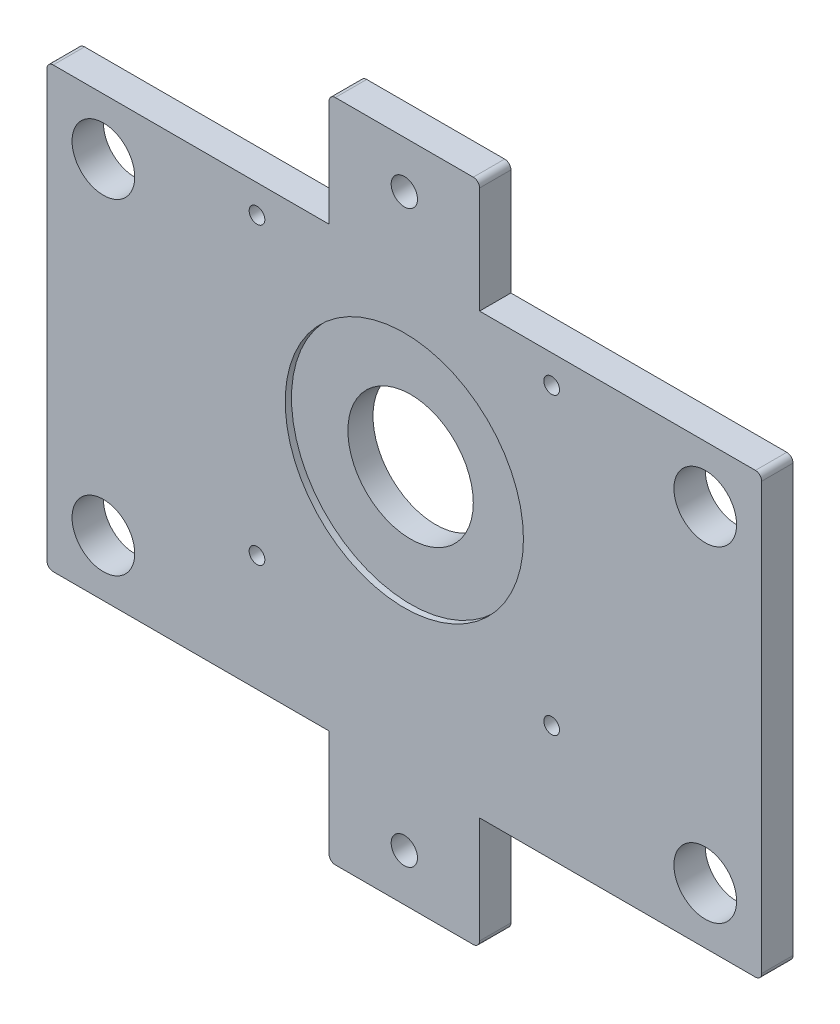
ISO-10303-21;
HEADER;
FILE_DESCRIPTION(('STEP AP214'),'2;1');
FILE_NAME('part.step','',(''),(''),'','','');
FILE_SCHEMA(('AUTOMOTIVE_DESIGN { 1 0 10303 214 1 1 1 1 }'));
ENDSEC;
DATA;
#1=APPLICATION_CONTEXT('core data for automotive mechanical design processes');
#2=APPLICATION_PROTOCOL_DEFINITION('international standard','automotive_design',2000,#1);
#3=PRODUCT_CONTEXT('',#1,'mechanical');
#4=PRODUCT('Part','Part','',(#3));
#5=PRODUCT_RELATED_PRODUCT_CATEGORY('part','',(#4));
#6=PRODUCT_DEFINITION_FORMATION('','',#4);
#7=PRODUCT_DEFINITION_CONTEXT('part definition',#1,'design');
#8=PRODUCT_DEFINITION('design','',#6,#7);
#9=PRODUCT_DEFINITION_SHAPE('','',#8);
#10=(LENGTH_UNIT() NAMED_UNIT(*) SI_UNIT(.MILLI.,.METRE.));
#11=(NAMED_UNIT(*) PLANE_ANGLE_UNIT() SI_UNIT($,.RADIAN.));
#12=(NAMED_UNIT(*) SI_UNIT($,.STERADIAN.) SOLID_ANGLE_UNIT());
#13=UNCERTAINTY_MEASURE_WITH_UNIT(LENGTH_MEASURE(1.E-05),#10,'distance_accuracy_value','');
#14=(GEOMETRIC_REPRESENTATION_CONTEXT(3) GLOBAL_UNCERTAINTY_ASSIGNED_CONTEXT((#13)) GLOBAL_UNIT_ASSIGNED_CONTEXT((#10,
#11,#12)) REPRESENTATION_CONTEXT('',''));
#15=CARTESIAN_POINT('',(0.,0.,0.));
#16=DIRECTION('',(0.,0.,1.));
#17=DIRECTION('',(1.,0.,0.));
#18=AXIS2_PLACEMENT_3D('',#15,#16,#17);
#19=CARTESIAN_POINT('',(0.,7.00000000000001,0.));
#20=DIRECTION('',(0.,0.,1.));
#21=DIRECTION('',(1.,0.,0.));
#22=AXIS2_PLACEMENT_3D('',#19,#20,#21);
#23=CYLINDRICAL_SURFACE('',#22,10.);
#24=CARTESIAN_POINT('',(0.,7.00000000000001,0.));
#25=DIRECTION('',(0.,0.,1.));
#26=DIRECTION('',(1.,0.,0.));
#27=AXIS2_PLACEMENT_3D('',#24,#25,#26);
#28=CIRCLE('',#27,10.);
#29=CARTESIAN_POINT('',(10.,7.00000000000001,0.));
#30=VERTEX_POINT('',#29);
#31=EDGE_CURVE('E446',#30,#30,#28,.T.);
#32=ORIENTED_EDGE('',*,*,#31,.F.);
#33=EDGE_LOOP('',(#32));
#34=FACE_BOUND('',#33,.T.);
#35=CARTESIAN_POINT('',(0.,7.00000000000001,4.));
#36=DIRECTION('',(0.,0.,1.));
#37=DIRECTION('',(1.,0.,0.));
#38=AXIS2_PLACEMENT_3D('',#35,#36,#37);
#39=CIRCLE('',#38,10.);
#40=CARTESIAN_POINT('',(10.,7.00000000000001,4.));
#41=VERTEX_POINT('',#40);
#42=EDGE_CURVE('E38',#41,#41,#39,.F.);
#43=ORIENTED_EDGE('',*,*,#42,.F.);
#44=EDGE_LOOP('',(#43));
#45=FACE_BOUND('',#44,.T.);
#46=ADVANCED_FACE('F34',(#34,#45),#23,.F.);
#47=CARTESIAN_POINT('',(0.,0.,5.));
#48=DIRECTION('',(0.,0.,1.));
#49=DIRECTION('',(1.,0.,0.));
#50=AXIS2_PLACEMENT_3D('',#47,#48,#49);
#51=PLANE('',#50);
#52=CARTESIAN_POINT('',(0.,7.00000000000001,5.));
#53=DIRECTION('',(0.,0.,1.));
#54=DIRECTION('',(1.,0.,0.));
#55=AXIS2_PLACEMENT_3D('',#52,#53,#54);
#56=CIRCLE('',#55,19.);
#57=CARTESIAN_POINT('',(19.,7.00000000000001,5.));
#58=VERTEX_POINT('',#57);
#59=EDGE_CURVE('E449',#58,#58,#56,.T.);
#60=ORIENTED_EDGE('',*,*,#59,.F.);
#61=EDGE_LOOP('',(#60));
#62=FACE_BOUND('',#61,.T.);
#63=CARTESIAN_POINT('',(0.,-45.5,5.));
#64=DIRECTION('',(0.,0.,1.));
#65=DIRECTION('',(1.,0.,0.));
#66=AXIS2_PLACEMENT_3D('',#63,#64,#65);
#67=CIRCLE('',#66,2.1);
#68=CARTESIAN_POINT('',(2.1,-45.5,5.));
#69=VERTEX_POINT('',#68);
#70=EDGE_CURVE('E443',#69,#69,#67,.T.);
#71=ORIENTED_EDGE('',*,*,#70,.F.);
#72=EDGE_LOOP('',(#71));
#73=FACE_BOUND('',#72,.T.);
#74=CARTESIAN_POINT('',(0.,45.5,5.));
#75=DIRECTION('',(0.,0.,1.));
#76=DIRECTION('',(1.,0.,0.));
#77=AXIS2_PLACEMENT_3D('',#74,#75,#76);
#78=CIRCLE('',#77,2.1);
#79=CARTESIAN_POINT('',(2.1,45.5,5.));
#80=VERTEX_POINT('',#79);
#81=EDGE_CURVE('E437',#80,#80,#78,.T.);
#82=ORIENTED_EDGE('',*,*,#81,.F.);
#83=EDGE_LOOP('',(#82));
#84=FACE_BOUND('',#83,.T.);
#85=CARTESIAN_POINT('',(47.9999999999998,26.,5.));
#86=DIRECTION('',(0.,0.,-1.));
#87=DIRECTION('',(-1.,0.,0.));
#88=AXIS2_PLACEMENT_3D('',#85,#86,#87);
#89=CIRCLE('',#88,5.);
#90=CARTESIAN_POINT('',(42.9999999999998,26.,5.));
#91=VERTEX_POINT('',#90);
#92=EDGE_CURVE('E423',#91,#91,#89,.T.);
#93=ORIENTED_EDGE('',*,*,#92,.T.);
#94=EDGE_LOOP('',(#93));
#95=FACE_BOUND('',#94,.T.);
#96=CARTESIAN_POINT('',(-47.9999999999998,-26.,5.));
#97=DIRECTION('',(0.,0.,1.));
#98=DIRECTION('',(1.,0.,0.));
#99=AXIS2_PLACEMENT_3D('',#96,#97,#98);
#100=CIRCLE('',#99,5.);
#101=CARTESIAN_POINT('',(-42.9999999999998,-26.,5.));
#102=VERTEX_POINT('',#101);
#103=EDGE_CURVE('E417',#102,#102,#100,.T.);
#104=ORIENTED_EDGE('',*,*,#103,.F.);
#105=EDGE_LOOP('',(#104));
#106=FACE_BOUND('',#105,.T.);
#107=CARTESIAN_POINT('',(-47.9999999999998,26.,5.));
#108=DIRECTION('',(0.,0.,1.));
#109=DIRECTION('',(1.,0.,0.));
#110=AXIS2_PLACEMENT_3D('',#107,#108,#109);
#111=CIRCLE('',#110,5.);
#112=CARTESIAN_POINT('',(-42.9999999999998,26.,5.));
#113=VERTEX_POINT('',#112);
#114=EDGE_CURVE('E411',#113,#113,#111,.T.);
#115=ORIENTED_EDGE('',*,*,#114,.F.);
#116=EDGE_LOOP('',(#115));
#117=FACE_BOUND('',#116,.T.);
#118=CARTESIAN_POINT('',(23.5,30.5,5.));
#119=DIRECTION('',(0.,0.,1.));
#120=DIRECTION('',(1.,0.,0.));
#121=AXIS2_PLACEMENT_3D('',#118,#119,#120);
#122=CIRCLE('',#121,1.24999999999999);
#123=CARTESIAN_POINT('',(24.75,30.5,5.));
#124=VERTEX_POINT('',#123);
#125=EDGE_CURVE('E407',#124,#124,#122,.T.);
#126=ORIENTED_EDGE('',*,*,#125,.F.);
#127=EDGE_LOOP('',(#126));
#128=FACE_BOUND('',#127,.T.);
#129=CARTESIAN_POINT('',(23.5,-16.5,5.));
#130=DIRECTION('',(0.,0.,1.));
#131=DIRECTION('',(1.,0.,0.));
#132=AXIS2_PLACEMENT_3D('',#129,#130,#131);
#133=CIRCLE('',#132,1.24999999999999);
#134=CARTESIAN_POINT('',(24.75,-16.5,5.));
#135=VERTEX_POINT('',#134);
#136=EDGE_CURVE('E401',#135,#135,#133,.T.);
#137=ORIENTED_EDGE('',*,*,#136,.F.);
#138=EDGE_LOOP('',(#137));
#139=FACE_BOUND('',#138,.T.);
#140=CARTESIAN_POINT('',(-23.5,30.5,5.));
#141=DIRECTION('',(0.,0.,1.));
#142=DIRECTION('',(1.,0.,0.));
#143=AXIS2_PLACEMENT_3D('',#140,#141,#142);
#144=CIRCLE('',#143,1.24999999999999);
#145=CARTESIAN_POINT('',(-22.25,30.5,5.));
#146=VERTEX_POINT('',#145);
#147=EDGE_CURVE('E395',#146,#146,#144,.T.);
#148=ORIENTED_EDGE('',*,*,#147,.F.);
#149=EDGE_LOOP('',(#148));
#150=FACE_BOUND('',#149,.T.);
#151=CARTESIAN_POINT('',(-23.5,-16.5,5.));
#152=DIRECTION('',(0.,0.,1.));
#153=DIRECTION('',(1.,0.,0.));
#154=AXIS2_PLACEMENT_3D('',#151,#152,#153);
#155=CIRCLE('',#154,1.24999999999999);
#156=CARTESIAN_POINT('',(-22.25,-16.5,5.));
#157=VERTEX_POINT('',#156);
#158=EDGE_CURVE('E389',#157,#157,#155,.T.);
#159=ORIENTED_EDGE('',*,*,#158,.F.);
#160=EDGE_LOOP('',(#159));
#161=FACE_BOUND('',#160,.T.);
#162=DIRECTION('',(0.,1.,0.));
#163=VECTOR('',#162,1.);
#164=CARTESIAN_POINT('',(12.0000000000002,35.,5.));
#165=LINE('',#164,#163);
#166=CARTESIAN_POINT('',(12.0000000000002,35.,5.));
#167=VERTEX_POINT('',#166);
#168=CARTESIAN_POINT('',(12.0000000000002,52.,5.));
#169=VERTEX_POINT('',#168);
#170=EDGE_CURVE('E217',#167,#169,#165,.T.);
#171=ORIENTED_EDGE('',*,*,#170,.T.);
#172=CARTESIAN_POINT('',(11.0000000000002,52.,5.));
#173=DIRECTION('',(0.,0.,1.));
#174=DIRECTION('',(1.,0.,0.));
#175=AXIS2_PLACEMENT_3D('',#172,#173,#174);
#176=CIRCLE('',#175,1.);
#177=CARTESIAN_POINT('',(11.0000000000002,53.,5.));
#178=VERTEX_POINT('',#177);
#179=EDGE_CURVE('E296',#169,#178,#176,.T.);
#180=ORIENTED_EDGE('',*,*,#179,.T.);
#181=DIRECTION('',(-1.,0.,0.));
#182=VECTOR('',#181,1.);
#183=CARTESIAN_POINT('',(12.0000000000002,53.,5.));
#184=LINE('',#183,#182);
#185=CARTESIAN_POINT('',(-10.9999999999998,53.,5.));
#186=VERTEX_POINT('',#185);
#187=EDGE_CURVE('E219',#178,#186,#184,.T.);
#188=ORIENTED_EDGE('',*,*,#187,.T.);
#189=CARTESIAN_POINT('',(-10.9999999999998,52.,5.));
#190=DIRECTION('',(0.,0.,1.));
#191=DIRECTION('',(1.,0.,0.));
#192=AXIS2_PLACEMENT_3D('',#189,#190,#191);
#193=CIRCLE('',#192,1.);
#194=CARTESIAN_POINT('',(-11.9999999999998,52.,5.));
#195=VERTEX_POINT('',#194);
#196=EDGE_CURVE('E50',#186,#195,#193,.T.);
#197=ORIENTED_EDGE('',*,*,#196,.T.);
#198=DIRECTION('',(0.,-1.,0.));
#199=VECTOR('',#198,1.);
#200=CARTESIAN_POINT('',(-11.9999999999998,53.,5.));
#201=LINE('',#200,#199);
#202=CARTESIAN_POINT('',(-11.9999999999998,35.,5.));
#203=VERTEX_POINT('',#202);
#204=EDGE_CURVE('E221',#195,#203,#201,.T.);
#205=ORIENTED_EDGE('',*,*,#204,.T.);
#206=DIRECTION('',(-1.,0.,0.));
#207=VECTOR('',#206,1.);
#208=CARTESIAN_POINT('',(-11.9999999999998,35.,5.));
#209=LINE('',#208,#207);
#210=CARTESIAN_POINT('',(-55.9999999999998,35.,5.));
#211=VERTEX_POINT('',#210);
#212=EDGE_CURVE('E255',#203,#211,#209,.T.);
#213=ORIENTED_EDGE('',*,*,#212,.T.);
#214=CARTESIAN_POINT('',(-55.9999999999998,34.,5.));
#215=DIRECTION('',(0.,0.,1.));
#216=DIRECTION('',(1.,0.,0.));
#217=AXIS2_PLACEMENT_3D('',#214,#215,#216);
#218=CIRCLE('',#217,1.);
#219=CARTESIAN_POINT('',(-56.9999999999998,34.,5.));
#220=VERTEX_POINT('',#219);
#221=EDGE_CURVE('E289',#211,#220,#218,.T.);
#222=ORIENTED_EDGE('',*,*,#221,.T.);
#223=DIRECTION('',(0.,-1.,0.));
#224=VECTOR('',#223,1.);
#225=CARTESIAN_POINT('',(-56.9999999999998,35.,5.));
#226=LINE('',#225,#224);
#227=CARTESIAN_POINT('',(-56.9999999999998,-34.,5.));
#228=VERTEX_POINT('',#227);
#229=EDGE_CURVE('E186',#220,#228,#226,.T.);
#230=ORIENTED_EDGE('',*,*,#229,.T.);
#231=CARTESIAN_POINT('',(-55.9999999999998,-34.,5.));
#232=DIRECTION('',(0.,0.,1.));
#233=DIRECTION('',(1.,0.,0.));
#234=AXIS2_PLACEMENT_3D('',#231,#232,#233);
#235=CIRCLE('',#234,1.);
#236=CARTESIAN_POINT('',(-55.9999999999998,-35.,5.));
#237=VERTEX_POINT('',#236);
#238=EDGE_CURVE('E182',#228,#237,#235,.T.);
#239=ORIENTED_EDGE('',*,*,#238,.T.);
#240=DIRECTION('',(1.,0.,0.));
#241=VECTOR('',#240,1.);
#242=CARTESIAN_POINT('',(-56.9999999999998,-35.,5.));
#243=LINE('',#242,#241);
#244=CARTESIAN_POINT('',(-11.9999999999998,-35.,5.));
#245=VERTEX_POINT('',#244);
#246=EDGE_CURVE('E172',#237,#245,#243,.T.);
#247=ORIENTED_EDGE('',*,*,#246,.T.);
#248=DIRECTION('',(0.,-1.,0.));
#249=VECTOR('',#248,1.);
#250=CARTESIAN_POINT('',(-11.9999999999998,-35.,5.));
#251=LINE('',#250,#249);
#252=CARTESIAN_POINT('',(-11.9999999999998,-52.,5.));
#253=VERTEX_POINT('',#252);
#254=EDGE_CURVE('E178',#245,#253,#251,.T.);
#255=ORIENTED_EDGE('',*,*,#254,.T.);
#256=CARTESIAN_POINT('',(-10.9999999999998,-52.,5.));
#257=DIRECTION('',(0.,0.,1.));
#258=DIRECTION('',(1.,0.,0.));
#259=AXIS2_PLACEMENT_3D('',#256,#257,#258);
#260=CIRCLE('',#259,1.);
#261=CARTESIAN_POINT('',(-10.9999999999998,-53.,5.));
#262=VERTEX_POINT('',#261);
#263=EDGE_CURVE('E291',#253,#262,#260,.T.);
#264=ORIENTED_EDGE('',*,*,#263,.T.);
#265=DIRECTION('',(1.,0.,0.));
#266=VECTOR('',#265,1.);
#267=CARTESIAN_POINT('',(-11.9999999999998,-53.,5.));
#268=LINE('',#267,#266);
#269=CARTESIAN_POINT('',(11.0000000000002,-53.,5.));
#270=VERTEX_POINT('',#269);
#271=EDGE_CURVE('E202',#262,#270,#268,.T.);
#272=ORIENTED_EDGE('',*,*,#271,.T.);
#273=CARTESIAN_POINT('',(11.0000000000002,-52.,5.));
#274=DIRECTION('',(0.,0.,1.));
#275=DIRECTION('',(1.,0.,0.));
#276=AXIS2_PLACEMENT_3D('',#273,#274,#275);
#277=CIRCLE('',#276,1.);
#278=CARTESIAN_POINT('',(12.0000000000002,-52.,5.));
#279=VERTEX_POINT('',#278);
#280=EDGE_CURVE('E293',#270,#279,#277,.T.);
#281=ORIENTED_EDGE('',*,*,#280,.T.);
#282=DIRECTION('',(0.,1.,0.));
#283=VECTOR('',#282,1.);
#284=CARTESIAN_POINT('',(12.0000000000002,-53.,5.));
#285=LINE('',#284,#283);
#286=CARTESIAN_POINT('',(12.0000000000002,-35.,5.));
#287=VERTEX_POINT('',#286);
#288=EDGE_CURVE('E205',#279,#287,#285,.T.);
#289=ORIENTED_EDGE('',*,*,#288,.T.);
#290=DIRECTION('',(1.,0.,0.));
#291=VECTOR('',#290,1.);
#292=CARTESIAN_POINT('',(12.0000000000002,-35.,5.));
#293=LINE('',#292,#291);
#294=CARTESIAN_POINT('',(56.0000000000002,-35.,5.));
#295=VERTEX_POINT('',#294);
#296=EDGE_CURVE('E210',#287,#295,#293,.T.);
#297=ORIENTED_EDGE('',*,*,#296,.T.);
#298=CARTESIAN_POINT('',(56.0000000000002,-34.,5.));
#299=DIRECTION('',(0.,0.,1.));
#300=DIRECTION('',(1.,0.,0.));
#301=AXIS2_PLACEMENT_3D('',#298,#299,#300);
#302=CIRCLE('',#301,1.);
#303=CARTESIAN_POINT('',(57.0000000000002,-34.,5.));
#304=VERTEX_POINT('',#303);
#305=EDGE_CURVE('E286',#295,#304,#302,.T.);
#306=ORIENTED_EDGE('',*,*,#305,.T.);
#307=DIRECTION('',(0.,1.,0.));
#308=VECTOR('',#307,1.);
#309=CARTESIAN_POINT('',(57.0000000000002,-35.,5.));
#310=LINE('',#309,#308);
#311=CARTESIAN_POINT('',(57.0000000000002,34.,5.));
#312=VERTEX_POINT('',#311);
#313=EDGE_CURVE('E213',#304,#312,#310,.T.);
#314=ORIENTED_EDGE('',*,*,#313,.T.);
#315=CARTESIAN_POINT('',(56.0000000000002,34.,5.));
#316=DIRECTION('',(0.,0.,1.));
#317=DIRECTION('',(1.,0.,0.));
#318=AXIS2_PLACEMENT_3D('',#315,#316,#317);
#319=CIRCLE('',#318,1.);
#320=CARTESIAN_POINT('',(56.0000000000002,35.,5.));
#321=VERTEX_POINT('',#320);
#322=EDGE_CURVE('E57',#312,#321,#319,.T.);
#323=ORIENTED_EDGE('',*,*,#322,.T.);
#324=DIRECTION('',(-1.,0.,0.));
#325=VECTOR('',#324,1.);
#326=CARTESIAN_POINT('',(57.0000000000002,35.,5.));
#327=LINE('',#326,#325);
#328=EDGE_CURVE('E215',#321,#167,#327,.T.);
#329=ORIENTED_EDGE('',*,*,#328,.T.);
#330=EDGE_LOOP('',(#171,#180,#188,#197,#205,#213,#222,#230,#239,#247,#255,#264,#272,#281,#289,
#297,#306,#314,#323,#329));
#331=FACE_BOUND('',#330,.T.);
#332=CARTESIAN_POINT('',(47.9999999999998,-26.,5.));
#333=DIRECTION('',(0.,0.,-1.));
#334=DIRECTION('',(-1.,0.,0.));
#335=AXIS2_PLACEMENT_3D('',#332,#333,#334);
#336=CIRCLE('',#335,5.);
#337=CARTESIAN_POINT('',(42.9999999999998,-26.,5.));
#338=VERTEX_POINT('',#337);
#339=EDGE_CURVE('E429',#338,#338,#336,.T.);
#340=ORIENTED_EDGE('',*,*,#339,.T.);
#341=EDGE_LOOP('',(#340));
#342=FACE_BOUND('',#341,.T.);
#343=ADVANCED_FACE('F175',(#62,#73,#84,#95,#106,#117,#128,#139,#150,#161,#331,#342),#51,.T.);
#344=CARTESIAN_POINT('',(0.,0.,0.));
#345=DIRECTION('',(0.,0.,1.));
#346=DIRECTION('',(1.,0.,0.));
#347=AXIS2_PLACEMENT_3D('',#344,#345,#346);
#348=PLANE('',#347);
#349=ORIENTED_EDGE('',*,*,#31,.T.);
#350=EDGE_LOOP('',(#349));
#351=FACE_BOUND('',#350,.T.);
#352=CARTESIAN_POINT('',(0.,-45.5,0.));
#353=DIRECTION('',(0.,0.,1.));
#354=DIRECTION('',(1.,0.,0.));
#355=AXIS2_PLACEMENT_3D('',#352,#353,#354);
#356=CIRCLE('',#355,2.1);
#357=CARTESIAN_POINT('',(2.1,-45.5,0.));
#358=VERTEX_POINT('',#357);
#359=EDGE_CURVE('E440',#358,#358,#356,.T.);
#360=ORIENTED_EDGE('',*,*,#359,.T.);
#361=EDGE_LOOP('',(#360));
#362=FACE_BOUND('',#361,.T.);
#363=CARTESIAN_POINT('',(0.,45.5,0.));
#364=DIRECTION('',(0.,0.,1.));
#365=DIRECTION('',(1.,0.,0.));
#366=AXIS2_PLACEMENT_3D('',#363,#364,#365);
#367=CIRCLE('',#366,2.1);
#368=CARTESIAN_POINT('',(2.1,45.5,0.));
#369=VERTEX_POINT('',#368);
#370=EDGE_CURVE('E432',#369,#369,#367,.T.);
#371=ORIENTED_EDGE('',*,*,#370,.T.);
#372=EDGE_LOOP('',(#371));
#373=FACE_BOUND('',#372,.T.);
#374=CARTESIAN_POINT('',(47.9999999999998,26.,0.));
#375=DIRECTION('',(0.,0.,-1.));
#376=DIRECTION('',(-1.,0.,0.));
#377=AXIS2_PLACEMENT_3D('',#374,#375,#376);
#378=CIRCLE('',#377,5.);
#379=CARTESIAN_POINT('',(42.9999999999998,26.,0.));
#380=VERTEX_POINT('',#379);
#381=EDGE_CURVE('E420',#380,#380,#378,.T.);
#382=ORIENTED_EDGE('',*,*,#381,.F.);
#383=EDGE_LOOP('',(#382));
#384=FACE_BOUND('',#383,.T.);
#385=CARTESIAN_POINT('',(-47.9999999999998,-26.,0.));
#386=DIRECTION('',(0.,0.,1.));
#387=DIRECTION('',(1.,0.,0.));
#388=AXIS2_PLACEMENT_3D('',#385,#386,#387);
#389=CIRCLE('',#388,5.);
#390=CARTESIAN_POINT('',(-42.9999999999998,-26.,0.));
#391=VERTEX_POINT('',#390);
#392=EDGE_CURVE('E414',#391,#391,#389,.T.);
#393=ORIENTED_EDGE('',*,*,#392,.T.);
#394=EDGE_LOOP('',(#393));
#395=FACE_BOUND('',#394,.T.);
#396=CARTESIAN_POINT('',(-47.9999999999998,26.,0.));
#397=DIRECTION('',(0.,0.,1.));
#398=DIRECTION('',(1.,0.,0.));
#399=AXIS2_PLACEMENT_3D('',#396,#397,#398);
#400=CIRCLE('',#399,5.);
#401=CARTESIAN_POINT('',(-42.9999999999998,26.,0.));
#402=VERTEX_POINT('',#401);
#403=EDGE_CURVE('E410',#402,#402,#400,.T.);
#404=ORIENTED_EDGE('',*,*,#403,.T.);
#405=EDGE_LOOP('',(#404));
#406=FACE_BOUND('',#405,.T.);
#407=CARTESIAN_POINT('',(23.5,30.5,0.));
#408=DIRECTION('',(0.,0.,1.));
#409=DIRECTION('',(1.,0.,0.));
#410=AXIS2_PLACEMENT_3D('',#407,#408,#409);
#411=CIRCLE('',#410,1.25);
#412=CARTESIAN_POINT('',(24.75,30.5,0.));
#413=VERTEX_POINT('',#412);
#414=EDGE_CURVE('E404',#413,#413,#411,.T.);
#415=ORIENTED_EDGE('',*,*,#414,.T.);
#416=EDGE_LOOP('',(#415));
#417=FACE_BOUND('',#416,.T.);
#418=CARTESIAN_POINT('',(23.5,-16.5,0.));
#419=DIRECTION('',(0.,0.,1.));
#420=DIRECTION('',(1.,0.,0.));
#421=AXIS2_PLACEMENT_3D('',#418,#419,#420);
#422=CIRCLE('',#421,1.25);
#423=CARTESIAN_POINT('',(24.75,-16.5,0.));
#424=VERTEX_POINT('',#423);
#425=EDGE_CURVE('E398',#424,#424,#422,.T.);
#426=ORIENTED_EDGE('',*,*,#425,.T.);
#427=EDGE_LOOP('',(#426));
#428=FACE_BOUND('',#427,.T.);
#429=CARTESIAN_POINT('',(-23.5,30.5,0.));
#430=DIRECTION('',(0.,0.,1.));
#431=DIRECTION('',(1.,0.,0.));
#432=AXIS2_PLACEMENT_3D('',#429,#430,#431);
#433=CIRCLE('',#432,1.25);
#434=CARTESIAN_POINT('',(-22.25,30.5,0.));
#435=VERTEX_POINT('',#434);
#436=EDGE_CURVE('E392',#435,#435,#433,.T.);
#437=ORIENTED_EDGE('',*,*,#436,.T.);
#438=EDGE_LOOP('',(#437));
#439=FACE_BOUND('',#438,.T.);
#440=CARTESIAN_POINT('',(-23.5,-16.5,0.));
#441=DIRECTION('',(0.,0.,1.));
#442=DIRECTION('',(1.,0.,0.));
#443=AXIS2_PLACEMENT_3D('',#440,#441,#442);
#444=CIRCLE('',#443,1.25);
#445=CARTESIAN_POINT('',(-22.25,-16.5,0.));
#446=VERTEX_POINT('',#445);
#447=EDGE_CURVE('E228',#446,#446,#444,.T.);
#448=ORIENTED_EDGE('',*,*,#447,.T.);
#449=EDGE_LOOP('',(#448));
#450=FACE_BOUND('',#449,.T.);
#451=DIRECTION('',(-1.,0.,0.));
#452=VECTOR('',#451,1.);
#453=CARTESIAN_POINT('',(12.0000000000002,53.,0.));
#454=LINE('',#453,#452);
#455=CARTESIAN_POINT('',(11.0000000000002,53.,0.));
#456=VERTEX_POINT('',#455);
#457=CARTESIAN_POINT('',(-10.9999999999998,53.,0.));
#458=VERTEX_POINT('',#457);
#459=EDGE_CURVE('E250',#456,#458,#454,.T.);
#460=ORIENTED_EDGE('',*,*,#459,.F.);
#461=CARTESIAN_POINT('',(11.0000000000002,52.,0.));
#462=DIRECTION('',(0.,0.,1.));
#463=DIRECTION('',(1.,0.,0.));
#464=AXIS2_PLACEMENT_3D('',#461,#462,#463);
#465=CIRCLE('',#464,1.);
#466=CARTESIAN_POINT('',(12.0000000000002,52.,0.));
#467=VERTEX_POINT('',#466);
#468=EDGE_CURVE('E281',#456,#467,#465,.F.);
#469=ORIENTED_EDGE('',*,*,#468,.T.);
#470=DIRECTION('',(0.,1.,0.));
#471=VECTOR('',#470,1.);
#472=CARTESIAN_POINT('',(12.0000000000002,35.,0.));
#473=LINE('',#472,#471);
#474=CARTESIAN_POINT('',(12.0000000000002,35.,0.));
#475=VERTEX_POINT('',#474);
#476=EDGE_CURVE('E247',#475,#467,#473,.T.);
#477=ORIENTED_EDGE('',*,*,#476,.F.);
#478=DIRECTION('',(-1.,0.,0.));
#479=VECTOR('',#478,1.);
#480=CARTESIAN_POINT('',(57.0000000000002,35.,0.));
#481=LINE('',#480,#479);
#482=CARTESIAN_POINT('',(56.0000000000002,35.,0.));
#483=VERTEX_POINT('',#482);
#484=EDGE_CURVE('E245',#483,#475,#481,.T.);
#485=ORIENTED_EDGE('',*,*,#484,.F.);
#486=CARTESIAN_POINT('',(56.0000000000002,34.,0.));
#487=DIRECTION('',(0.,0.,1.));
#488=DIRECTION('',(1.,0.,0.));
#489=AXIS2_PLACEMENT_3D('',#486,#487,#488);
#490=CIRCLE('',#489,1.);
#491=CARTESIAN_POINT('',(57.0000000000002,34.,0.));
#492=VERTEX_POINT('',#491);
#493=EDGE_CURVE('E267',#483,#492,#490,.F.);
#494=ORIENTED_EDGE('',*,*,#493,.T.);
#495=DIRECTION('',(0.,1.,0.));
#496=VECTOR('',#495,1.);
#497=CARTESIAN_POINT('',(57.0000000000002,-35.,0.));
#498=LINE('',#497,#496);
#499=CARTESIAN_POINT('',(57.0000000000002,-34.,0.));
#500=VERTEX_POINT('',#499);
#501=EDGE_CURVE('E242',#500,#492,#498,.T.);
#502=ORIENTED_EDGE('',*,*,#501,.F.);
#503=CARTESIAN_POINT('',(56.0000000000002,-34.,0.));
#504=DIRECTION('',(0.,0.,1.));
#505=DIRECTION('',(1.,0.,0.));
#506=AXIS2_PLACEMENT_3D('',#503,#504,#505);
#507=CIRCLE('',#506,1.);
#508=CARTESIAN_POINT('',(56.0000000000002,-35.,0.));
#509=VERTEX_POINT('',#508);
#510=EDGE_CURVE('E269',#500,#509,#507,.F.);
#511=ORIENTED_EDGE('',*,*,#510,.T.);
#512=DIRECTION('',(1.,0.,0.));
#513=VECTOR('',#512,1.);
#514=CARTESIAN_POINT('',(12.0000000000002,-35.,0.));
#515=LINE('',#514,#513);
#516=CARTESIAN_POINT('',(12.0000000000002,-35.,0.));
#517=VERTEX_POINT('',#516);
#518=EDGE_CURVE('E239',#517,#509,#515,.T.);
#519=ORIENTED_EDGE('',*,*,#518,.F.);
#520=DIRECTION('',(0.,1.,0.));
#521=VECTOR('',#520,1.);
#522=CARTESIAN_POINT('',(12.0000000000002,-53.,0.));
#523=LINE('',#522,#521);
#524=CARTESIAN_POINT('',(12.0000000000002,-52.,0.));
#525=VERTEX_POINT('',#524);
#526=EDGE_CURVE('E237',#525,#517,#523,.T.);
#527=ORIENTED_EDGE('',*,*,#526,.F.);
#528=CARTESIAN_POINT('',(11.0000000000002,-52.,0.));
#529=DIRECTION('',(0.,0.,1.));
#530=DIRECTION('',(1.,0.,0.));
#531=AXIS2_PLACEMENT_3D('',#528,#529,#530);
#532=CIRCLE('',#531,1.);
#533=CARTESIAN_POINT('',(11.0000000000002,-53.,0.));
#534=VERTEX_POINT('',#533);
#535=EDGE_CURVE('E277',#525,#534,#532,.F.);
#536=ORIENTED_EDGE('',*,*,#535,.T.);
#537=DIRECTION('',(1.,0.,0.));
#538=VECTOR('',#537,1.);
#539=CARTESIAN_POINT('',(-11.9999999999998,-53.,0.));
#540=LINE('',#539,#538);
#541=CARTESIAN_POINT('',(-10.9999999999998,-53.,0.));
#542=VERTEX_POINT('',#541);
#543=EDGE_CURVE('E234',#542,#534,#540,.T.);
#544=ORIENTED_EDGE('',*,*,#543,.F.);
#545=CARTESIAN_POINT('',(-10.9999999999998,-52.,0.));
#546=DIRECTION('',(0.,0.,1.));
#547=DIRECTION('',(1.,0.,0.));
#548=AXIS2_PLACEMENT_3D('',#545,#546,#547);
#549=CIRCLE('',#548,1.);
#550=CARTESIAN_POINT('',(-11.9999999999998,-52.,0.));
#551=VERTEX_POINT('',#550);
#552=EDGE_CURVE('E275',#542,#551,#549,.F.);
#553=ORIENTED_EDGE('',*,*,#552,.T.);
#554=DIRECTION('',(0.,-1.,0.));
#555=VECTOR('',#554,1.);
#556=CARTESIAN_POINT('',(-11.9999999999998,-35.,0.));
#557=LINE('',#556,#555);
#558=CARTESIAN_POINT('',(-11.9999999999998,-35.,0.));
#559=VERTEX_POINT('',#558);
#560=EDGE_CURVE('E232',#559,#551,#557,.T.);
#561=ORIENTED_EDGE('',*,*,#560,.F.);
#562=DIRECTION('',(1.,0.,0.));
#563=VECTOR('',#562,1.);
#564=CARTESIAN_POINT('',(-56.9999999999998,-35.,0.));
#565=LINE('',#564,#563);
#566=CARTESIAN_POINT('',(-55.9999999999998,-35.,0.));
#567=VERTEX_POINT('',#566);
#568=EDGE_CURVE('E192',#567,#559,#565,.T.);
#569=ORIENTED_EDGE('',*,*,#568,.F.);
#570=CARTESIAN_POINT('',(-55.9999999999998,-34.,0.));
#571=DIRECTION('',(0.,0.,1.));
#572=DIRECTION('',(1.,0.,0.));
#573=AXIS2_PLACEMENT_3D('',#570,#571,#572);
#574=CIRCLE('',#573,1.);
#575=CARTESIAN_POINT('',(-56.9999999999998,-34.,0.));
#576=VERTEX_POINT('',#575);
#577=EDGE_CURVE('E271',#567,#576,#574,.F.);
#578=ORIENTED_EDGE('',*,*,#577,.T.);
#579=DIRECTION('',(0.,-1.,0.));
#580=VECTOR('',#579,1.);
#581=CARTESIAN_POINT('',(-56.9999999999998,35.,0.));
#582=LINE('',#581,#580);
#583=CARTESIAN_POINT('',(-56.9999999999998,34.,0.));
#584=VERTEX_POINT('',#583);
#585=EDGE_CURVE('E227',#584,#576,#582,.T.);
#586=ORIENTED_EDGE('',*,*,#585,.F.);
#587=CARTESIAN_POINT('',(-55.9999999999998,34.,0.));
#588=DIRECTION('',(0.,0.,1.));
#589=DIRECTION('',(1.,0.,0.));
#590=AXIS2_PLACEMENT_3D('',#587,#588,#589);
#591=CIRCLE('',#590,1.);
#592=CARTESIAN_POINT('',(-55.9999999999998,35.,0.));
#593=VERTEX_POINT('',#592);
#594=EDGE_CURVE('E273',#584,#593,#591,.F.);
#595=ORIENTED_EDGE('',*,*,#594,.T.);
#596=DIRECTION('',(-1.,0.,0.));
#597=VECTOR('',#596,1.);
#598=CARTESIAN_POINT('',(-11.9999999999998,35.,0.));
#599=LINE('',#598,#597);
#600=CARTESIAN_POINT('',(-11.9999999999998,35.,0.));
#601=VERTEX_POINT('',#600);
#602=EDGE_CURVE('E224',#601,#593,#599,.T.);
#603=ORIENTED_EDGE('',*,*,#602,.F.);
#604=DIRECTION('',(0.,-1.,0.));
#605=VECTOR('',#604,1.);
#606=CARTESIAN_POINT('',(-11.9999999999998,53.,0.));
#607=LINE('',#606,#605);
#608=CARTESIAN_POINT('',(-11.9999999999998,52.,0.));
#609=VERTEX_POINT('',#608);
#610=EDGE_CURVE('E253',#609,#601,#607,.T.);
#611=ORIENTED_EDGE('',*,*,#610,.F.);
#612=CARTESIAN_POINT('',(-10.9999999999998,52.,0.));
#613=DIRECTION('',(0.,0.,1.));
#614=DIRECTION('',(1.,0.,0.));
#615=AXIS2_PLACEMENT_3D('',#612,#613,#614);
#616=CIRCLE('',#615,1.);
#617=EDGE_CURVE('E279',#609,#458,#616,.F.);
#618=ORIENTED_EDGE('',*,*,#617,.T.);
#619=EDGE_LOOP('',(#460,#469,#477,#485,#494,#502,#511,#519,#527,#536,#544,#553,#561,#569,#578,
#586,#595,#603,#611,#618));
#620=FACE_BOUND('',#619,.T.);
#621=CARTESIAN_POINT('',(47.9999999999998,-26.,0.));
#622=DIRECTION('',(0.,0.,-1.));
#623=DIRECTION('',(-1.,0.,0.));
#624=AXIS2_PLACEMENT_3D('',#621,#622,#623);
#625=CIRCLE('',#624,5.);
#626=CARTESIAN_POINT('',(42.9999999999998,-26.,0.));
#627=VERTEX_POINT('',#626);
#628=EDGE_CURVE('E426',#627,#627,#625,.T.);
#629=ORIENTED_EDGE('',*,*,#628,.F.);
#630=EDGE_LOOP('',(#629));
#631=FACE_BOUND('',#630,.T.);
#632=ADVANCED_FACE('F342',(#351,#362,#373,#384,#395,#406,#417,#428,#439,#450,#620,#631),#348,.F.);
#633=CARTESIAN_POINT('',(-11.9999999999998,35.,5.));
#634=DIRECTION('',(0.,-1.,0.));
#635=DIRECTION('',(1.,0.,0.));
#636=AXIS2_PLACEMENT_3D('',#633,#634,#635);
#637=PLANE('',#636);
#638=ORIENTED_EDGE('',*,*,#602,.T.);
#639=DIRECTION('',(0.,0.,-1.));
#640=VECTOR('',#639,1.);
#641=CARTESIAN_POINT('',(-55.9999999999998,35.,5.));
#642=LINE('',#641,#640);
#643=EDGE_CURVE('E315',#593,#211,#642,.F.);
#644=ORIENTED_EDGE('',*,*,#643,.T.);
#645=ORIENTED_EDGE('',*,*,#212,.F.);
#646=DIRECTION('',(0.,0.,-1.));
#647=VECTOR('',#646,1.);
#648=CARTESIAN_POINT('',(-11.9999999999998,35.,5.));
#649=LINE('',#648,#647);
#650=EDGE_CURVE('E223',#203,#601,#649,.T.);
#651=ORIENTED_EDGE('',*,*,#650,.T.);
#652=EDGE_LOOP('',(#638,#644,#645,#651));
#653=FACE_BOUND('',#652,.T.);
#654=ADVANCED_FACE('F516',(#653),#637,.F.);
#655=CARTESIAN_POINT('',(-56.9999999999998,35.,5.));
#656=DIRECTION('',(1.,0.,0.));
#657=DIRECTION('',(0.,1.,0.));
#658=AXIS2_PLACEMENT_3D('',#655,#656,#657);
#659=PLANE('',#658);
#660=ORIENTED_EDGE('',*,*,#229,.F.);
#661=DIRECTION('',(0.,0.,-1.));
#662=VECTOR('',#661,1.);
#663=CARTESIAN_POINT('',(-56.9999999999998,34.,5.));
#664=LINE('',#663,#662);
#665=EDGE_CURVE('E312',#220,#584,#664,.T.);
#666=ORIENTED_EDGE('',*,*,#665,.T.);
#667=ORIENTED_EDGE('',*,*,#585,.T.);
#668=DIRECTION('',(0.,0.,-1.));
#669=VECTOR('',#668,1.);
#670=CARTESIAN_POINT('',(-56.9999999999998,-34.,5.));
#671=LINE('',#670,#669);
#672=EDGE_CURVE('E310',#576,#228,#671,.F.);
#673=ORIENTED_EDGE('',*,*,#672,.T.);
#674=EDGE_LOOP('',(#660,#666,#667,#673));
#675=FACE_BOUND('',#674,.T.);
#676=ADVANCED_FACE('F382',(#675),#659,.F.);
#677=CARTESIAN_POINT('',(-56.9999999999998,-35.,5.));
#678=DIRECTION('',(0.,1.,0.));
#679=DIRECTION('',(-1.,0.,0.));
#680=AXIS2_PLACEMENT_3D('',#677,#678,#679);
#681=PLANE('',#680);
#682=ORIENTED_EDGE('',*,*,#246,.F.);
#683=DIRECTION('',(0.,0.,-1.));
#684=VECTOR('',#683,1.);
#685=CARTESIAN_POINT('',(-55.9999999999998,-35.,5.));
#686=LINE('',#685,#684);
#687=EDGE_CURVE('E317',#237,#567,#686,.T.);
#688=ORIENTED_EDGE('',*,*,#687,.T.);
#689=ORIENTED_EDGE('',*,*,#568,.T.);
#690=DIRECTION('',(0.,0.,-1.));
#691=VECTOR('',#690,1.);
#692=CARTESIAN_POINT('',(-11.9999999999998,-35.,5.));
#693=LINE('',#692,#691);
#694=EDGE_CURVE('E189',#245,#559,#693,.T.);
#695=ORIENTED_EDGE('',*,*,#694,.F.);
#696=EDGE_LOOP('',(#682,#688,#689,#695));
#697=FACE_BOUND('',#696,.T.);
#698=ADVANCED_FACE('F190',(#697),#681,.F.);
#699=CARTESIAN_POINT('',(-11.9999999999998,-35.,5.));
#700=DIRECTION('',(1.,0.,0.));
#701=DIRECTION('',(0.,0.,-1.));
#702=AXIS2_PLACEMENT_3D('',#699,#700,#701);
#703=PLANE('',#702);
#704=ORIENTED_EDGE('',*,*,#560,.T.);
#705=DIRECTION('',(0.,0.,-1.));
#706=VECTOR('',#705,1.);
#707=CARTESIAN_POINT('',(-11.9999999999998,-52.,5.));
#708=LINE('',#707,#706);
#709=EDGE_CURVE('E201',#551,#253,#708,.F.);
#710=ORIENTED_EDGE('',*,*,#709,.T.);
#711=ORIENTED_EDGE('',*,*,#254,.F.);
#712=ORIENTED_EDGE('',*,*,#694,.T.);
#713=EDGE_LOOP('',(#704,#710,#711,#712));
#714=FACE_BOUND('',#713,.T.);
#715=ADVANCED_FACE('F199',(#714),#703,.F.);
#716=CARTESIAN_POINT('',(-11.9999999999998,-53.,5.));
#717=DIRECTION('',(0.,1.,0.));
#718=DIRECTION('',(-1.,0.,0.));
#719=AXIS2_PLACEMENT_3D('',#716,#717,#718);
#720=PLANE('',#719);
#721=ORIENTED_EDGE('',*,*,#543,.T.);
#722=DIRECTION('',(0.,0.,-1.));
#723=VECTOR('',#722,1.);
#724=CARTESIAN_POINT('',(11.0000000000002,-53.,5.));
#725=LINE('',#724,#723);
#726=EDGE_CURVE('E307',#534,#270,#725,.F.);
#727=ORIENTED_EDGE('',*,*,#726,.T.);
#728=ORIENTED_EDGE('',*,*,#271,.F.);
#729=DIRECTION('',(0.,0.,-1.));
#730=VECTOR('',#729,1.);
#731=CARTESIAN_POINT('',(-10.9999999999998,-53.,5.));
#732=LINE('',#731,#730);
#733=EDGE_CURVE('E304',#262,#542,#732,.T.);
#734=ORIENTED_EDGE('',*,*,#733,.T.);
#735=EDGE_LOOP('',(#721,#727,#728,#734));
#736=FACE_BOUND('',#735,.T.);
#737=ADVANCED_FACE('F534',(#736),#720,.F.);
#738=CARTESIAN_POINT('',(12.0000000000002,-53.,5.));
#739=DIRECTION('',(-1.,0.,0.));
#740=DIRECTION('',(0.,-1.,0.));
#741=AXIS2_PLACEMENT_3D('',#738,#739,#740);
#742=PLANE('',#741);
#743=ORIENTED_EDGE('',*,*,#288,.F.);
#744=DIRECTION('',(0.,0.,-1.));
#745=VECTOR('',#744,1.);
#746=CARTESIAN_POINT('',(12.0000000000002,-52.,5.));
#747=LINE('',#746,#745);
#748=EDGE_CURVE('E301',#279,#525,#747,.T.);
#749=ORIENTED_EDGE('',*,*,#748,.T.);
#750=ORIENTED_EDGE('',*,*,#526,.T.);
#751=DIRECTION('',(0.,0.,-1.));
#752=VECTOR('',#751,1.);
#753=CARTESIAN_POINT('',(12.0000000000002,-35.,5.));
#754=LINE('',#753,#752);
#755=EDGE_CURVE('E197',#287,#517,#754,.T.);
#756=ORIENTED_EDGE('',*,*,#755,.F.);
#757=EDGE_LOOP('',(#743,#749,#750,#756));
#758=FACE_BOUND('',#757,.T.);
#759=ADVANCED_FACE('F531',(#758),#742,.F.);
#760=CARTESIAN_POINT('',(12.0000000000002,-35.,5.));
#761=DIRECTION('',(0.,1.,0.));
#762=DIRECTION('',(0.,0.,1.));
#763=AXIS2_PLACEMENT_3D('',#760,#761,#762);
#764=PLANE('',#763);
#765=ORIENTED_EDGE('',*,*,#518,.T.);
#766=DIRECTION('',(0.,0.,-1.));
#767=VECTOR('',#766,1.);
#768=CARTESIAN_POINT('',(56.0000000000002,-35.,5.));
#769=LINE('',#768,#767);
#770=EDGE_CURVE('E43',#509,#295,#769,.F.);
#771=ORIENTED_EDGE('',*,*,#770,.T.);
#772=ORIENTED_EDGE('',*,*,#296,.F.);
#773=ORIENTED_EDGE('',*,*,#755,.T.);
#774=EDGE_LOOP('',(#765,#771,#772,#773));
#775=FACE_BOUND('',#774,.T.);
#776=ADVANCED_FACE('F327',(#775),#764,.F.);
#777=CARTESIAN_POINT('',(57.0000000000002,-35.,5.));
#778=DIRECTION('',(-1.,0.,0.));
#779=DIRECTION('',(0.,-1.,0.));
#780=AXIS2_PLACEMENT_3D('',#777,#778,#779);
#781=PLANE('',#780);
#782=ORIENTED_EDGE('',*,*,#313,.F.);
#783=DIRECTION('',(0.,0.,-1.));
#784=VECTOR('',#783,1.);
#785=CARTESIAN_POINT('',(57.0000000000002,-34.,5.));
#786=LINE('',#785,#784);
#787=EDGE_CURVE('E321',#304,#500,#786,.T.);
#788=ORIENTED_EDGE('',*,*,#787,.T.);
#789=ORIENTED_EDGE('',*,*,#501,.T.);
#790=DIRECTION('',(0.,0.,-1.));
#791=VECTOR('',#790,1.);
#792=CARTESIAN_POINT('',(57.0000000000002,34.,5.));
#793=LINE('',#792,#791);
#794=EDGE_CURVE('E319',#492,#312,#793,.F.);
#795=ORIENTED_EDGE('',*,*,#794,.T.);
#796=EDGE_LOOP('',(#782,#788,#789,#795));
#797=FACE_BOUND('',#796,.T.);
#798=ADVANCED_FACE('F338',(#797),#781,.F.);
#799=CARTESIAN_POINT('',(57.0000000000002,35.,5.));
#800=DIRECTION('',(0.,-1.,0.));
#801=DIRECTION('',(1.,0.,0.));
#802=AXIS2_PLACEMENT_3D('',#799,#800,#801);
#803=PLANE('',#802);
#804=ORIENTED_EDGE('',*,*,#328,.F.);
#805=DIRECTION('',(0.,0.,-1.));
#806=VECTOR('',#805,1.);
#807=CARTESIAN_POINT('',(56.0000000000002,35.,5.));
#808=LINE('',#807,#806);
#809=EDGE_CURVE('E11',#321,#483,#808,.T.);
#810=ORIENTED_EDGE('',*,*,#809,.T.);
#811=ORIENTED_EDGE('',*,*,#484,.T.);
#812=DIRECTION('',(0.,0.,-1.));
#813=VECTOR('',#812,1.);
#814=CARTESIAN_POINT('',(12.0000000000002,35.,5.));
#815=LINE('',#814,#813);
#816=EDGE_CURVE('E258',#167,#475,#815,.T.);
#817=ORIENTED_EDGE('',*,*,#816,.F.);
#818=EDGE_LOOP('',(#804,#810,#811,#817));
#819=FACE_BOUND('',#818,.T.);
#820=ADVANCED_FACE('F349',(#819),#803,.F.);
#821=CARTESIAN_POINT('',(12.0000000000002,35.,5.));
#822=DIRECTION('',(-1.,0.,0.));
#823=DIRECTION('',(0.,0.,1.));
#824=AXIS2_PLACEMENT_3D('',#821,#822,#823);
#825=PLANE('',#824);
#826=ORIENTED_EDGE('',*,*,#476,.T.);
#827=DIRECTION('',(0.,0.,-1.));
#828=VECTOR('',#827,1.);
#829=CARTESIAN_POINT('',(12.0000000000002,52.,5.));
#830=LINE('',#829,#828);
#831=EDGE_CURVE('E283',#467,#169,#830,.F.);
#832=ORIENTED_EDGE('',*,*,#831,.T.);
#833=ORIENTED_EDGE('',*,*,#170,.F.);
#834=ORIENTED_EDGE('',*,*,#816,.T.);
#835=EDGE_LOOP('',(#826,#832,#833,#834));
#836=FACE_BOUND('',#835,.T.);
#837=ADVANCED_FACE('F522',(#836),#825,.F.);
#838=CARTESIAN_POINT('',(12.0000000000002,53.,5.));
#839=DIRECTION('',(0.,-1.,0.));
#840=DIRECTION('',(0.,0.,-1.));
#841=AXIS2_PLACEMENT_3D('',#838,#839,#840);
#842=PLANE('',#841);
#843=ORIENTED_EDGE('',*,*,#187,.F.);
#844=DIRECTION('',(0.,0.,-1.));
#845=VECTOR('',#844,1.);
#846=CARTESIAN_POINT('',(11.0000000000002,53.,5.));
#847=LINE('',#846,#845);
#848=EDGE_CURVE('E264',#178,#456,#847,.T.);
#849=ORIENTED_EDGE('',*,*,#848,.T.);
#850=ORIENTED_EDGE('',*,*,#459,.T.);
#851=DIRECTION('',(0.,0.,-1.));
#852=VECTOR('',#851,1.);
#853=CARTESIAN_POINT('',(-10.9999999999998,53.,5.));
#854=LINE('',#853,#852);
#855=EDGE_CURVE('E196',#458,#186,#854,.F.);
#856=ORIENTED_EDGE('',*,*,#855,.T.);
#857=EDGE_LOOP('',(#843,#849,#850,#856));
#858=FACE_BOUND('',#857,.T.);
#859=ADVANCED_FACE('F360',(#858),#842,.F.);
#860=CARTESIAN_POINT('',(-11.9999999999998,53.,5.));
#861=DIRECTION('',(1.,0.,0.));
#862=DIRECTION('',(0.,1.,0.));
#863=AXIS2_PLACEMENT_3D('',#860,#861,#862);
#864=PLANE('',#863);
#865=ORIENTED_EDGE('',*,*,#204,.F.);
#866=DIRECTION('',(0.,0.,-1.));
#867=VECTOR('',#866,1.);
#868=CARTESIAN_POINT('',(-11.9999999999998,52.,5.));
#869=LINE('',#868,#867);
#870=EDGE_CURVE('E298',#195,#609,#869,.T.);
#871=ORIENTED_EDGE('',*,*,#870,.T.);
#872=ORIENTED_EDGE('',*,*,#610,.T.);
#873=ORIENTED_EDGE('',*,*,#650,.F.);
#874=EDGE_LOOP('',(#865,#871,#872,#873));
#875=FACE_BOUND('',#874,.T.);
#876=ADVANCED_FACE('F368',(#875),#864,.F.);
#877=CARTESIAN_POINT('',(11.0000000000002,52.,5.));
#878=DIRECTION('',(0.,0.,-1.));
#879=DIRECTION('',(-1.,0.,0.));
#880=AXIS2_PLACEMENT_3D('',#877,#878,#879);
#881=CYLINDRICAL_SURFACE('',#880,1.);
#882=ORIENTED_EDGE('',*,*,#179,.F.);
#883=ORIENTED_EDGE('',*,*,#831,.F.);
#884=ORIENTED_EDGE('',*,*,#468,.F.);
#885=ORIENTED_EDGE('',*,*,#848,.F.);
#886=EDGE_LOOP('',(#882,#883,#884,#885));
#887=FACE_BOUND('',#886,.T.);
#888=ADVANCED_FACE('F358',(#887),#881,.T.);
#889=CARTESIAN_POINT('',(-10.9999999999998,52.,5.));
#890=DIRECTION('',(0.,0.,-1.));
#891=DIRECTION('',(-1.,0.,0.));
#892=AXIS2_PLACEMENT_3D('',#889,#890,#891);
#893=CYLINDRICAL_SURFACE('',#892,1.);
#894=ORIENTED_EDGE('',*,*,#196,.F.);
#895=ORIENTED_EDGE('',*,*,#855,.F.);
#896=ORIENTED_EDGE('',*,*,#617,.F.);
#897=ORIENTED_EDGE('',*,*,#870,.F.);
#898=EDGE_LOOP('',(#894,#895,#896,#897));
#899=FACE_BOUND('',#898,.T.);
#900=ADVANCED_FACE('F366',(#899),#893,.T.);
#901=CARTESIAN_POINT('',(11.0000000000002,-52.,5.));
#902=DIRECTION('',(0.,0.,-1.));
#903=DIRECTION('',(-1.,0.,0.));
#904=AXIS2_PLACEMENT_3D('',#901,#902,#903);
#905=CYLINDRICAL_SURFACE('',#904,1.);
#906=ORIENTED_EDGE('',*,*,#280,.F.);
#907=ORIENTED_EDGE('',*,*,#726,.F.);
#908=ORIENTED_EDGE('',*,*,#535,.F.);
#909=ORIENTED_EDGE('',*,*,#748,.F.);
#910=EDGE_LOOP('',(#906,#907,#908,#909));
#911=FACE_BOUND('',#910,.T.);
#912=ADVANCED_FACE('F551',(#911),#905,.T.);
#913=CARTESIAN_POINT('',(-10.9999999999998,-52.,5.));
#914=DIRECTION('',(0.,0.,-1.));
#915=DIRECTION('',(-1.,0.,0.));
#916=AXIS2_PLACEMENT_3D('',#913,#914,#915);
#917=CYLINDRICAL_SURFACE('',#916,1.);
#918=ORIENTED_EDGE('',*,*,#263,.F.);
#919=ORIENTED_EDGE('',*,*,#709,.F.);
#920=ORIENTED_EDGE('',*,*,#552,.F.);
#921=ORIENTED_EDGE('',*,*,#733,.F.);
#922=EDGE_LOOP('',(#918,#919,#920,#921));
#923=FACE_BOUND('',#922,.T.);
#924=ADVANCED_FACE('F554',(#923),#917,.T.);
#925=CARTESIAN_POINT('',(-55.9999999999998,34.,5.));
#926=DIRECTION('',(0.,0.,-1.));
#927=DIRECTION('',(-1.,0.,0.));
#928=AXIS2_PLACEMENT_3D('',#925,#926,#927);
#929=CYLINDRICAL_SURFACE('',#928,1.);
#930=ORIENTED_EDGE('',*,*,#221,.F.);
#931=ORIENTED_EDGE('',*,*,#643,.F.);
#932=ORIENTED_EDGE('',*,*,#594,.F.);
#933=ORIENTED_EDGE('',*,*,#665,.F.);
#934=EDGE_LOOP('',(#930,#931,#932,#933));
#935=FACE_BOUND('',#934,.T.);
#936=ADVANCED_FACE('F379',(#935),#929,.T.);
#937=CARTESIAN_POINT('',(-55.9999999999998,-34.,5.));
#938=DIRECTION('',(0.,0.,-1.));
#939=DIRECTION('',(-1.,0.,0.));
#940=AXIS2_PLACEMENT_3D('',#937,#938,#939);
#941=CYLINDRICAL_SURFACE('',#940,1.);
#942=ORIENTED_EDGE('',*,*,#238,.F.);
#943=ORIENTED_EDGE('',*,*,#672,.F.);
#944=ORIENTED_EDGE('',*,*,#577,.F.);
#945=ORIENTED_EDGE('',*,*,#687,.F.);
#946=EDGE_LOOP('',(#942,#943,#944,#945));
#947=FACE_BOUND('',#946,.T.);
#948=ADVANCED_FACE('F385',(#947),#941,.T.);
#949=CARTESIAN_POINT('',(56.0000000000002,-34.,5.));
#950=DIRECTION('',(0.,0.,-1.));
#951=DIRECTION('',(-1.,0.,0.));
#952=AXIS2_PLACEMENT_3D('',#949,#950,#951);
#953=CYLINDRICAL_SURFACE('',#952,1.);
#954=ORIENTED_EDGE('',*,*,#305,.F.);
#955=ORIENTED_EDGE('',*,*,#770,.F.);
#956=ORIENTED_EDGE('',*,*,#510,.F.);
#957=ORIENTED_EDGE('',*,*,#787,.F.);
#958=EDGE_LOOP('',(#954,#955,#956,#957));
#959=FACE_BOUND('',#958,.T.);
#960=ADVANCED_FACE('F335',(#959),#953,.T.);
#961=CARTESIAN_POINT('',(56.0000000000002,34.,5.));
#962=DIRECTION('',(0.,0.,-1.));
#963=DIRECTION('',(-1.,0.,0.));
#964=AXIS2_PLACEMENT_3D('',#961,#962,#963);
#965=CYLINDRICAL_SURFACE('',#964,1.);
#966=ORIENTED_EDGE('',*,*,#322,.F.);
#967=ORIENTED_EDGE('',*,*,#794,.F.);
#968=ORIENTED_EDGE('',*,*,#493,.F.);
#969=ORIENTED_EDGE('',*,*,#809,.F.);
#970=EDGE_LOOP('',(#966,#967,#968,#969));
#971=FACE_BOUND('',#970,.T.);
#972=ADVANCED_FACE('F36',(#971),#965,.T.);
#973=CARTESIAN_POINT('',(-23.5,-16.5,5.));
#974=DIRECTION('',(0.,0.,1.));
#975=DIRECTION('',(1.,0.,0.));
#976=AXIS2_PLACEMENT_3D('',#973,#974,#975);
#977=CYLINDRICAL_SURFACE('',#976,1.24999999999999);
#978=ORIENTED_EDGE('',*,*,#447,.F.);
#979=EDGE_LOOP('',(#978));
#980=FACE_BOUND('',#979,.T.);
#981=ORIENTED_EDGE('',*,*,#158,.T.);
#982=EDGE_LOOP('',(#981));
#983=FACE_BOUND('',#982,.T.);
#984=ADVANCED_FACE('F509',(#980,#983),#977,.F.);
#985=CARTESIAN_POINT('',(-23.5,30.5,5.));
#986=DIRECTION('',(0.,0.,1.));
#987=DIRECTION('',(1.,0.,0.));
#988=AXIS2_PLACEMENT_3D('',#985,#986,#987);
#989=CYLINDRICAL_SURFACE('',#988,1.24999999999999);
#990=ORIENTED_EDGE('',*,*,#436,.F.);
#991=EDGE_LOOP('',(#990));
#992=FACE_BOUND('',#991,.T.);
#993=ORIENTED_EDGE('',*,*,#147,.T.);
#994=EDGE_LOOP('',(#993));
#995=FACE_BOUND('',#994,.T.);
#996=ADVANCED_FACE('F505',(#992,#995),#989,.F.);
#997=CARTESIAN_POINT('',(23.5,-16.5,5.));
#998=DIRECTION('',(0.,0.,1.));
#999=DIRECTION('',(1.,0.,0.));
#1000=AXIS2_PLACEMENT_3D('',#997,#998,#999);
#1001=CYLINDRICAL_SURFACE('',#1000,1.24999999999999);
#1002=ORIENTED_EDGE('',*,*,#425,.F.);
#1003=EDGE_LOOP('',(#1002));
#1004=FACE_BOUND('',#1003,.T.);
#1005=ORIENTED_EDGE('',*,*,#136,.T.);
#1006=EDGE_LOOP('',(#1005));
#1007=FACE_BOUND('',#1006,.T.);
#1008=ADVANCED_FACE('F501',(#1004,#1007),#1001,.F.);
#1009=CARTESIAN_POINT('',(23.5,30.5,5.));
#1010=DIRECTION('',(0.,0.,1.));
#1011=DIRECTION('',(1.,0.,0.));
#1012=AXIS2_PLACEMENT_3D('',#1009,#1010,#1011);
#1013=CYLINDRICAL_SURFACE('',#1012,1.24999999999999);
#1014=ORIENTED_EDGE('',*,*,#414,.F.);
#1015=EDGE_LOOP('',(#1014));
#1016=FACE_BOUND('',#1015,.T.);
#1017=ORIENTED_EDGE('',*,*,#125,.T.);
#1018=EDGE_LOOP('',(#1017));
#1019=FACE_BOUND('',#1018,.T.);
#1020=ADVANCED_FACE('F497',(#1016,#1019),#1013,.F.);
#1021=CARTESIAN_POINT('',(-47.9999999999998,26.,0.));
#1022=DIRECTION('',(0.,0.,1.));
#1023=DIRECTION('',(1.,0.,0.));
#1024=AXIS2_PLACEMENT_3D('',#1021,#1022,#1023);
#1025=CYLINDRICAL_SURFACE('',#1024,5.);
#1026=ORIENTED_EDGE('',*,*,#403,.F.);
#1027=EDGE_LOOP('',(#1026));
#1028=FACE_BOUND('',#1027,.T.);
#1029=ORIENTED_EDGE('',*,*,#114,.T.);
#1030=EDGE_LOOP('',(#1029));
#1031=FACE_BOUND('',#1030,.T.);
#1032=ADVANCED_FACE('F493',(#1028,#1031),#1025,.F.);
#1033=CARTESIAN_POINT('',(-47.9999999999998,-26.,0.));
#1034=DIRECTION('',(0.,0.,1.));
#1035=DIRECTION('',(1.,0.,0.));
#1036=AXIS2_PLACEMENT_3D('',#1033,#1034,#1035);
#1037=CYLINDRICAL_SURFACE('',#1036,5.);
#1038=ORIENTED_EDGE('',*,*,#392,.F.);
#1039=EDGE_LOOP('',(#1038));
#1040=FACE_BOUND('',#1039,.T.);
#1041=ORIENTED_EDGE('',*,*,#103,.T.);
#1042=EDGE_LOOP('',(#1041));
#1043=FACE_BOUND('',#1042,.T.);
#1044=ADVANCED_FACE('F489',(#1040,#1043),#1037,.F.);
#1045=CARTESIAN_POINT('',(47.9999999999998,26.,0.));
#1046=DIRECTION('',(0.,0.,1.));
#1047=DIRECTION('',(1.,0.,0.));
#1048=AXIS2_PLACEMENT_3D('',#1045,#1046,#1047);
#1049=CYLINDRICAL_SURFACE('',#1048,5.);
#1050=ORIENTED_EDGE('',*,*,#381,.T.);
#1051=EDGE_LOOP('',(#1050));
#1052=FACE_BOUND('',#1051,.T.);
#1053=ORIENTED_EDGE('',*,*,#92,.F.);
#1054=EDGE_LOOP('',(#1053));
#1055=FACE_BOUND('',#1054,.T.);
#1056=ADVANCED_FACE('F485',(#1052,#1055),#1049,.F.);
#1057=CARTESIAN_POINT('',(47.9999999999998,-26.,0.));
#1058=DIRECTION('',(0.,0.,1.));
#1059=DIRECTION('',(1.,0.,0.));
#1060=AXIS2_PLACEMENT_3D('',#1057,#1058,#1059);
#1061=CYLINDRICAL_SURFACE('',#1060,5.);
#1062=ORIENTED_EDGE('',*,*,#628,.T.);
#1063=EDGE_LOOP('',(#1062));
#1064=FACE_BOUND('',#1063,.T.);
#1065=ORIENTED_EDGE('',*,*,#339,.F.);
#1066=EDGE_LOOP('',(#1065));
#1067=FACE_BOUND('',#1066,.T.);
#1068=ADVANCED_FACE('F481',(#1064,#1067),#1061,.F.);
#1069=CARTESIAN_POINT('',(0.,45.5,5.));
#1070=DIRECTION('',(0.,0.,1.));
#1071=DIRECTION('',(1.,0.,0.));
#1072=AXIS2_PLACEMENT_3D('',#1069,#1070,#1071);
#1073=CYLINDRICAL_SURFACE('',#1072,2.1);
#1074=ORIENTED_EDGE('',*,*,#370,.F.);
#1075=EDGE_LOOP('',(#1074));
#1076=FACE_BOUND('',#1075,.T.);
#1077=ORIENTED_EDGE('',*,*,#81,.T.);
#1078=EDGE_LOOP('',(#1077));
#1079=FACE_BOUND('',#1078,.T.);
#1080=ADVANCED_FACE('F477',(#1076,#1079),#1073,.F.);
#1081=CARTESIAN_POINT('',(0.,-45.5,5.));
#1082=DIRECTION('',(0.,0.,1.));
#1083=DIRECTION('',(1.,0.,0.));
#1084=AXIS2_PLACEMENT_3D('',#1081,#1082,#1083);
#1085=CYLINDRICAL_SURFACE('',#1084,2.1);
#1086=ORIENTED_EDGE('',*,*,#359,.F.);
#1087=EDGE_LOOP('',(#1086));
#1088=FACE_BOUND('',#1087,.T.);
#1089=ORIENTED_EDGE('',*,*,#70,.T.);
#1090=EDGE_LOOP('',(#1089));
#1091=FACE_BOUND('',#1090,.T.);
#1092=ADVANCED_FACE('F474',(#1088,#1091),#1085,.F.);
#1093=CARTESIAN_POINT('',(0.,7.00000000000001,4.));
#1094=DIRECTION('',(0.,0.,1.));
#1095=DIRECTION('',(1.,0.,0.));
#1096=AXIS2_PLACEMENT_3D('',#1093,#1094,#1095);
#1097=PLANE('',#1096);
#1098=CARTESIAN_POINT('',(0.,7.00000000000001,4.));
#1099=DIRECTION('',(0.,0.,1.));
#1100=DIRECTION('',(1.,0.,0.));
#1101=AXIS2_PLACEMENT_3D('',#1098,#1099,#1100);
#1102=CIRCLE('',#1101,19.);
#1103=CARTESIAN_POINT('',(19.,7.00000000000001,4.));
#1104=VERTEX_POINT('',#1103);
#1105=EDGE_CURVE('E452',#1104,#1104,#1102,.T.);
#1106=ORIENTED_EDGE('',*,*,#1105,.T.);
#1107=EDGE_LOOP('',(#1106));
#1108=FACE_BOUND('',#1107,.T.);
#1109=ORIENTED_EDGE('',*,*,#42,.T.);
#1110=EDGE_LOOP('',(#1109));
#1111=FACE_BOUND('',#1110,.T.);
#1112=ADVANCED_FACE('F459',(#1108,#1111),#1097,.T.);
#1113=CARTESIAN_POINT('',(0.,7.00000000000001,4.));
#1114=DIRECTION('',(0.,0.,1.));
#1115=DIRECTION('',(1.,0.,0.));
#1116=AXIS2_PLACEMENT_3D('',#1113,#1114,#1115);
#1117=CYLINDRICAL_SURFACE('',#1116,19.);
#1118=ORIENTED_EDGE('',*,*,#1105,.F.);
#1119=EDGE_LOOP('',(#1118));
#1120=FACE_BOUND('',#1119,.T.);
#1121=ORIENTED_EDGE('',*,*,#59,.T.);
#1122=EDGE_LOOP('',(#1121));
#1123=FACE_BOUND('',#1122,.T.);
#1124=ADVANCED_FACE('F472',(#1120,#1123),#1117,.F.);
#1125=CLOSED_SHELL('',(#46,#343,#632,#654,#676,#698,#715,#737,#759,#776,#798,#820,#837,#859,
#876,#888,#900,#912,#924,#936,#948,#960,#972,#984,#996,#1008,#1020,#1032,#1044,#1056,#1068,
#1080,#1092,#1112,#1124));
#1126=MANIFOLD_SOLID_BREP('B2',#1125);
#1127=ADVANCED_BREP_SHAPE_REPRESENTATION('',(#18,#1126),#14);
#1128=SHAPE_DEFINITION_REPRESENTATION(#9,#1127);
ENDSEC;
END-ISO-10303-21;
